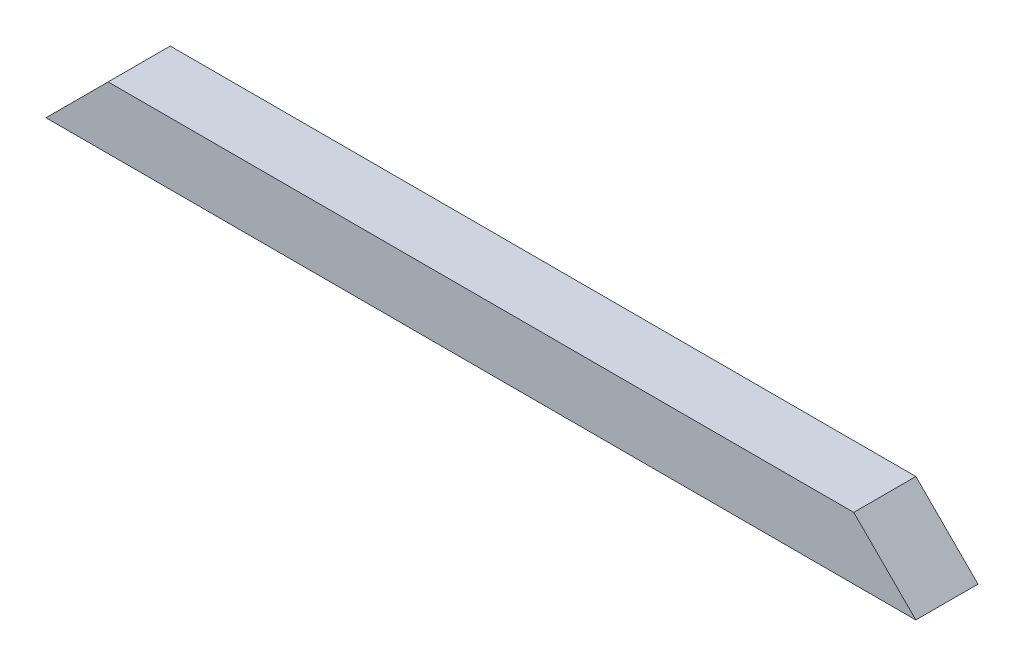
ISO-10303-21;
HEADER;
FILE_DESCRIPTION(('STEP AP214'),'2;1');
FILE_NAME('part.step','',(''),(''),'','','');
FILE_SCHEMA(('AUTOMOTIVE_DESIGN { 1 0 10303 214 1 1 1 1 }'));
ENDSEC;
DATA;
#1=APPLICATION_CONTEXT('core data for automotive mechanical design processes');
#2=APPLICATION_PROTOCOL_DEFINITION('international standard','automotive_design',2000,#1);
#3=PRODUCT_CONTEXT('',#1,'mechanical');
#4=PRODUCT('Part','Part','',(#3));
#5=PRODUCT_RELATED_PRODUCT_CATEGORY('part','',(#4));
#6=PRODUCT_DEFINITION_FORMATION('','',#4);
#7=PRODUCT_DEFINITION_CONTEXT('part definition',#1,'design');
#8=PRODUCT_DEFINITION('design','',#6,#7);
#9=PRODUCT_DEFINITION_SHAPE('','',#8);
#10=(LENGTH_UNIT() NAMED_UNIT(*) SI_UNIT(.MILLI.,.METRE.));
#11=(NAMED_UNIT(*) PLANE_ANGLE_UNIT() SI_UNIT($,.RADIAN.));
#12=(NAMED_UNIT(*) SI_UNIT($,.STERADIAN.) SOLID_ANGLE_UNIT());
#13=UNCERTAINTY_MEASURE_WITH_UNIT(LENGTH_MEASURE(1.E-05),#10,'distance_accuracy_value','');
#14=(GEOMETRIC_REPRESENTATION_CONTEXT(3) GLOBAL_UNCERTAINTY_ASSIGNED_CONTEXT((#13)) GLOBAL_UNIT_ASSIGNED_CONTEXT((#10,
#11,#12)) REPRESENTATION_CONTEXT('',''));
#15=CARTESIAN_POINT('',(0.,0.,0.));
#16=DIRECTION('',(0.,0.,1.));
#17=DIRECTION('',(1.,0.,0.));
#18=AXIS2_PLACEMENT_3D('',#15,#16,#17);
#19=CARTESIAN_POINT('',(355.6,25.4,50.8));
#20=DIRECTION('',(0.,-1.,0.));
#21=DIRECTION('',(1.,0.,0.));
#22=AXIS2_PLACEMENT_3D('',#19,#20,#21);
#23=PLANE('',#22);
#24=DIRECTION('',(-1.,0.,0.));
#25=VECTOR('',#24,1.);
#26=CARTESIAN_POINT('',(355.6,25.4,50.8));
#27=LINE('',#26,#25);
#28=CARTESIAN_POINT('',(304.8,25.4,50.8));
#29=VERTEX_POINT('',#28);
#30=CARTESIAN_POINT('',(-304.8,25.4,50.8));
#31=VERTEX_POINT('',#30);
#32=EDGE_CURVE('E86',#29,#31,#27,.T.);
#33=ORIENTED_EDGE('',*,*,#32,.F.);
#34=DIRECTION('',(0.,0.,1.));
#35=VECTOR('',#34,1.);
#36=CARTESIAN_POINT('',(304.8,25.4,0.));
#37=LINE('',#36,#35);
#38=CARTESIAN_POINT('',(304.8,25.4,0.));
#39=VERTEX_POINT('',#38);
#40=EDGE_CURVE('E76',#39,#29,#37,.T.);
#41=ORIENTED_EDGE('',*,*,#40,.F.);
#42=DIRECTION('',(-1.,0.,0.));
#43=VECTOR('',#42,1.);
#44=CARTESIAN_POINT('',(355.6,25.4,0.));
#45=LINE('',#44,#43);
#46=CARTESIAN_POINT('',(-304.8,25.4,0.));
#47=VERTEX_POINT('',#46);
#48=EDGE_CURVE('E85',#39,#47,#45,.T.);
#49=ORIENTED_EDGE('',*,*,#48,.T.);
#50=DIRECTION('',(0.,0.,1.));
#51=VECTOR('',#50,1.);
#52=CARTESIAN_POINT('',(-304.8,25.4,0.));
#53=LINE('',#52,#51);
#54=EDGE_CURVE('E94',#47,#31,#53,.T.);
#55=ORIENTED_EDGE('',*,*,#54,.T.);
#56=EDGE_LOOP('',(#33,#41,#49,#55));
#57=FACE_BOUND('',#56,.T.);
#58=ADVANCED_FACE('F33',(#57),#23,.F.);
#59=CARTESIAN_POINT('',(0.,0.,50.8));
#60=DIRECTION('',(0.,0.,1.));
#61=DIRECTION('',(1.,0.,0.));
#62=AXIS2_PLACEMENT_3D('',#59,#60,#61);
#63=PLANE('',#62);
#64=DIRECTION('',(0.707106781186547,-0.707106781186548,0.));
#65=VECTOR('',#64,1.);
#66=CARTESIAN_POINT('',(165.1,165.1,50.8));
#67=LINE('',#66,#65);
#68=CARTESIAN_POINT('',(355.6,-25.4,50.8));
#69=VERTEX_POINT('',#68);
#70=EDGE_CURVE('E56',#29,#69,#67,.T.);
#71=ORIENTED_EDGE('',*,*,#70,.F.);
#72=ORIENTED_EDGE('',*,*,#32,.T.);
#73=DIRECTION('',(-0.707106781186547,-0.707106781186548,0.));
#74=VECTOR('',#73,1.);
#75=CARTESIAN_POINT('',(-165.1,165.1,50.8));
#76=LINE('',#75,#74);
#77=CARTESIAN_POINT('',(-355.6,-25.4,50.8));
#78=VERTEX_POINT('',#77);
#79=EDGE_CURVE('E87',#31,#78,#76,.T.);
#80=ORIENTED_EDGE('',*,*,#79,.T.);
#81=DIRECTION('',(1.,0.,0.));
#82=VECTOR('',#81,1.);
#83=CARTESIAN_POINT('',(355.6,-25.4,50.8));
#84=LINE('',#83,#82);
#85=EDGE_CURVE('E90',#78,#69,#84,.T.);
#86=ORIENTED_EDGE('',*,*,#85,.T.);
#87=EDGE_LOOP('',(#71,#72,#80,#86));
#88=FACE_BOUND('',#87,.T.);
#89=ADVANCED_FACE('F105',(#88),#63,.T.);
#90=CARTESIAN_POINT('',(0.,0.,0.));
#91=DIRECTION('',(0.,0.,1.));
#92=DIRECTION('',(1.,0.,0.));
#93=AXIS2_PLACEMENT_3D('',#90,#91,#92);
#94=PLANE('',#93);
#95=ORIENTED_EDGE('',*,*,#48,.F.);
#96=DIRECTION('',(0.707106781186547,-0.707106781186548,0.));
#97=VECTOR('',#96,1.);
#98=CARTESIAN_POINT('',(165.1,165.1,0.));
#99=LINE('',#98,#97);
#100=CARTESIAN_POINT('',(355.6,-25.3999999999999,0.));
#101=VERTEX_POINT('',#100);
#102=EDGE_CURVE('E73',#39,#101,#99,.T.);
#103=ORIENTED_EDGE('',*,*,#102,.T.);
#104=DIRECTION('',(1.,0.,0.));
#105=VECTOR('',#104,1.);
#106=CARTESIAN_POINT('',(355.6,-25.4,0.));
#107=LINE('',#106,#105);
#108=CARTESIAN_POINT('',(-355.6,-25.4,0.));
#109=VERTEX_POINT('',#108);
#110=EDGE_CURVE('E91',#109,#101,#107,.T.);
#111=ORIENTED_EDGE('',*,*,#110,.F.);
#112=DIRECTION('',(-0.707106781186547,-0.707106781186548,0.));
#113=VECTOR('',#112,1.);
#114=CARTESIAN_POINT('',(-165.1,165.1,0.));
#115=LINE('',#114,#113);
#116=EDGE_CURVE('E48',#47,#109,#115,.T.);
#117=ORIENTED_EDGE('',*,*,#116,.F.);
#118=EDGE_LOOP('',(#95,#103,#111,#117));
#119=FACE_BOUND('',#118,.T.);
#120=ADVANCED_FACE('F89',(#119),#94,.F.);
#121=CARTESIAN_POINT('',(355.6,-25.4,50.8));
#122=DIRECTION('',(0.,1.,0.));
#123=DIRECTION('',(-1.,0.,0.));
#124=AXIS2_PLACEMENT_3D('',#121,#122,#123);
#125=PLANE('',#124);
#126=ORIENTED_EDGE('',*,*,#110,.T.);
#127=DIRECTION('',(0.,0.,-1.));
#128=VECTOR('',#127,1.);
#129=CARTESIAN_POINT('',(355.6,-25.4,50.8));
#130=LINE('',#129,#128);
#131=EDGE_CURVE('E41',#69,#101,#130,.T.);
#132=ORIENTED_EDGE('',*,*,#131,.F.);
#133=ORIENTED_EDGE('',*,*,#85,.F.);
#134=DIRECTION('',(0.,0.,-1.));
#135=VECTOR('',#134,1.);
#136=CARTESIAN_POINT('',(-355.6,-25.4,50.8));
#137=LINE('',#136,#135);
#138=EDGE_CURVE('E11',#78,#109,#137,.T.);
#139=ORIENTED_EDGE('',*,*,#138,.T.);
#140=EDGE_LOOP('',(#126,#132,#133,#139));
#141=FACE_BOUND('',#140,.T.);
#142=ADVANCED_FACE('F35',(#141),#125,.F.);
#143=CARTESIAN_POINT('',(-165.1,165.1,0.));
#144=DIRECTION('',(-0.707106781186548,0.707106781186547,0.));
#145=DIRECTION('',(-0.707106781186547,-0.707106781186548,0.));
#146=AXIS2_PLACEMENT_3D('',#143,#144,#145);
#147=PLANE('',#146);
#148=ORIENTED_EDGE('',*,*,#79,.F.);
#149=ORIENTED_EDGE('',*,*,#54,.F.);
#150=ORIENTED_EDGE('',*,*,#116,.T.);
#151=ORIENTED_EDGE('',*,*,#138,.F.);
#152=EDGE_LOOP('',(#148,#149,#150,#151));
#153=FACE_BOUND('',#152,.T.);
#154=ADVANCED_FACE('F107',(#153),#147,.T.);
#155=CARTESIAN_POINT('',(165.1,165.1,0.));
#156=DIRECTION('',(-0.707106781186548,-0.707106781186547,0.));
#157=DIRECTION('',(0.707106781186547,-0.707106781186548,0.));
#158=AXIS2_PLACEMENT_3D('',#155,#156,#157);
#159=PLANE('',#158);
#160=ORIENTED_EDGE('',*,*,#70,.T.);
#161=ORIENTED_EDGE('',*,*,#131,.T.);
#162=ORIENTED_EDGE('',*,*,#102,.F.);
#163=ORIENTED_EDGE('',*,*,#40,.T.);
#164=EDGE_LOOP('',(#160,#161,#162,#163));
#165=FACE_BOUND('',#164,.T.);
#166=ADVANCED_FACE('F75',(#165),#159,.F.);
#167=CLOSED_SHELL('',(#58,#89,#120,#142,#154,#166));
#168=MANIFOLD_SOLID_BREP('B2',#167);
#169=ADVANCED_BREP_SHAPE_REPRESENTATION('',(#18,#168),#14);
#170=SHAPE_DEFINITION_REPRESENTATION(#9,#169);
ENDSEC;
END-ISO-10303-21;
